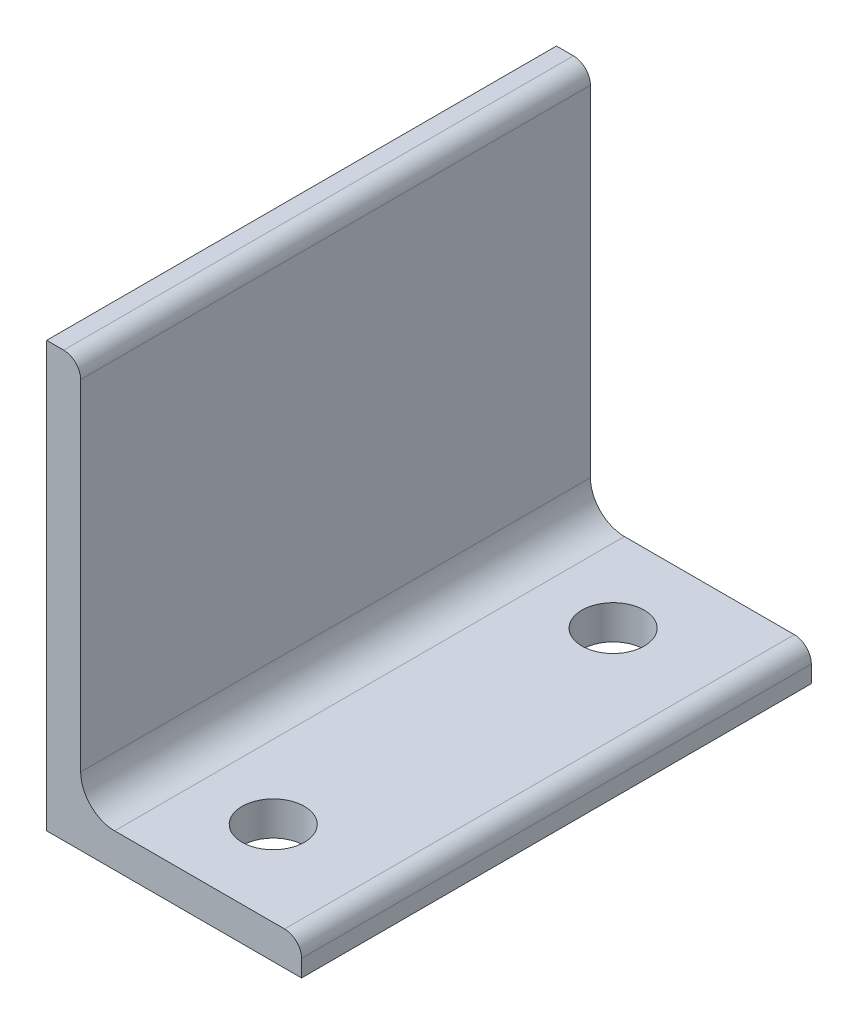
ISO-10303-21;
HEADER;
FILE_DESCRIPTION(('STEP AP214'),'2;1');
FILE_NAME('part.step','',(''),(''),'','','');
FILE_SCHEMA(('AUTOMOTIVE_DESIGN { 1 0 10303 214 1 1 1 1 }'));
ENDSEC;
DATA;
#1=APPLICATION_CONTEXT('core data for automotive mechanical design processes');
#2=APPLICATION_PROTOCOL_DEFINITION('international standard','automotive_design',2000,#1);
#3=PRODUCT_CONTEXT('',#1,'mechanical');
#4=PRODUCT('Part','Part','',(#3));
#5=PRODUCT_RELATED_PRODUCT_CATEGORY('part','',(#4));
#6=PRODUCT_DEFINITION_FORMATION('','',#4);
#7=PRODUCT_DEFINITION_CONTEXT('part definition',#1,'design');
#8=PRODUCT_DEFINITION('design','',#6,#7);
#9=PRODUCT_DEFINITION_SHAPE('','',#8);
#10=(LENGTH_UNIT() NAMED_UNIT(*) SI_UNIT(.MILLI.,.METRE.));
#11=(NAMED_UNIT(*) PLANE_ANGLE_UNIT() SI_UNIT($,.RADIAN.));
#12=(NAMED_UNIT(*) SI_UNIT($,.STERADIAN.) SOLID_ANGLE_UNIT());
#13=UNCERTAINTY_MEASURE_WITH_UNIT(LENGTH_MEASURE(1.E-05),#10,'distance_accuracy_value','');
#14=(GEOMETRIC_REPRESENTATION_CONTEXT(3) GLOBAL_UNCERTAINTY_ASSIGNED_CONTEXT((#13)) GLOBAL_UNIT_ASSIGNED_CONTEXT((#10,
#11,#12)) REPRESENTATION_CONTEXT('',''));
#15=CARTESIAN_POINT('',(0.,0.,0.));
#16=DIRECTION('',(0.,0.,1.));
#17=DIRECTION('',(1.,0.,0.));
#18=AXIS2_PLACEMENT_3D('',#15,#16,#17);
#19=CARTESIAN_POINT('',(-45.,-75.,90.));
#20=DIRECTION('',(0.,1.,0.));
#21=DIRECTION('',(0.,0.,1.));
#22=AXIS2_PLACEMENT_3D('',#19,#20,#21);
#23=PLANE('',#22);
#24=CARTESIAN_POINT('',(5.,-75.,60.));
#25=DIRECTION('',(0.,1.,0.));
#26=DIRECTION('',(0.,0.,1.));
#27=AXIS2_PLACEMENT_3D('',#24,#25,#26);
#28=CIRCLE('',#27,11.);
#29=CARTESIAN_POINT('',(-6.,-75.,60.));
#30=VERTEX_POINT('',#29);
#31=EDGE_CURVE('E146',#30,#30,#28,.F.);
#32=ORIENTED_EDGE('',*,*,#31,.F.);
#33=EDGE_LOOP('',(#32));
#34=FACE_BOUND('',#33,.T.);
#35=CARTESIAN_POINT('',(5.,-75.,-60.));
#36=DIRECTION('',(0.,1.,0.));
#37=DIRECTION('',(0.,0.,1.));
#38=AXIS2_PLACEMENT_3D('',#35,#36,#37);
#39=CIRCLE('',#38,11.);
#40=CARTESIAN_POINT('',(-5.99999999999999,-75.,-60.));
#41=VERTEX_POINT('',#40);
#42=EDGE_CURVE('E204',#41,#41,#39,.F.);
#43=ORIENTED_EDGE('',*,*,#42,.F.);
#44=EDGE_LOOP('',(#43));
#45=FACE_BOUND('',#44,.T.);
#46=DIRECTION('',(1.,0.,0.));
#47=VECTOR('',#46,1.);
#48=CARTESIAN_POINT('',(-45.,-75.,-90.));
#49=LINE('',#48,#47);
#50=CARTESIAN_POINT('',(-45.,-75.,-90.));
#51=VERTEX_POINT('',#50);
#52=CARTESIAN_POINT('',(45.,-75.,-90.));
#53=VERTEX_POINT('',#52);
#54=EDGE_CURVE('E142',#51,#53,#49,.T.);
#55=ORIENTED_EDGE('',*,*,#54,.T.);
#56=DIRECTION('',(0.,0.,-1.));
#57=VECTOR('',#56,1.);
#58=CARTESIAN_POINT('',(45.,-75.,90.));
#59=LINE('',#58,#57);
#60=CARTESIAN_POINT('',(45.,-75.,90.));
#61=VERTEX_POINT('',#60);
#62=EDGE_CURVE('E11',#61,#53,#59,.T.);
#63=ORIENTED_EDGE('',*,*,#62,.F.);
#64=DIRECTION('',(1.,0.,0.));
#65=VECTOR('',#64,1.);
#66=CARTESIAN_POINT('',(-45.,-75.,90.));
#67=LINE('',#66,#65);
#68=CARTESIAN_POINT('',(-45.,-75.,90.));
#69=VERTEX_POINT('',#68);
#70=EDGE_CURVE('E159',#69,#61,#67,.T.);
#71=ORIENTED_EDGE('',*,*,#70,.F.);
#72=DIRECTION('',(0.,0.,-1.));
#73=VECTOR('',#72,1.);
#74=CARTESIAN_POINT('',(-45.,-75.,90.));
#75=LINE('',#74,#73);
#76=EDGE_CURVE('E138',#69,#51,#75,.T.);
#77=ORIENTED_EDGE('',*,*,#76,.T.);
#78=EDGE_LOOP('',(#55,#63,#71,#77));
#79=FACE_BOUND('',#78,.T.);
#80=ADVANCED_FACE('F40',(#34,#45,#79),#23,.F.);
#81=CARTESIAN_POINT('',(45.,-75.,90.));
#82=DIRECTION('',(-1.,0.,0.));
#83=DIRECTION('',(0.,0.,1.));
#84=AXIS2_PLACEMENT_3D('',#81,#82,#83);
#85=PLANE('',#84);
#86=DIRECTION('',(0.,1.,0.));
#87=VECTOR('',#86,1.);
#88=CARTESIAN_POINT('',(45.,-75.,-90.));
#89=LINE('',#88,#87);
#90=CARTESIAN_POINT('',(45.,-69.,-90.));
#91=VERTEX_POINT('',#90);
#92=EDGE_CURVE('E145',#53,#91,#89,.T.);
#93=ORIENTED_EDGE('',*,*,#92,.T.);
#94=DIRECTION('',(0.,0.,-1.));
#95=VECTOR('',#94,1.);
#96=CARTESIAN_POINT('',(45.,-69.,90.));
#97=LINE('',#96,#95);
#98=CARTESIAN_POINT('',(45.,-69.,90.));
#99=VERTEX_POINT('',#98);
#100=EDGE_CURVE('E48',#99,#91,#97,.T.);
#101=ORIENTED_EDGE('',*,*,#100,.F.);
#102=DIRECTION('',(0.,1.,0.));
#103=VECTOR('',#102,1.);
#104=CARTESIAN_POINT('',(45.,-75.,90.));
#105=LINE('',#104,#103);
#106=EDGE_CURVE('E102',#61,#99,#105,.T.);
#107=ORIENTED_EDGE('',*,*,#106,.F.);
#108=ORIENTED_EDGE('',*,*,#62,.T.);
#109=EDGE_LOOP('',(#93,#101,#107,#108));
#110=FACE_BOUND('',#109,.T.);
#111=ADVANCED_FACE('F228',(#110),#85,.F.);
#112=CARTESIAN_POINT('',(39.,-69.,90.));
#113=DIRECTION('',(0.,0.,-1.));
#114=DIRECTION('',(-1.,0.,0.));
#115=AXIS2_PLACEMENT_3D('',#112,#113,#114);
#116=CYLINDRICAL_SURFACE('',#115,6.);
#117=CARTESIAN_POINT('',(39.,-69.,-90.));
#118=DIRECTION('',(0.,0.,1.));
#119=DIRECTION('',(1.,0.,0.));
#120=AXIS2_PLACEMENT_3D('',#117,#118,#119);
#121=CIRCLE('',#120,6.);
#122=CARTESIAN_POINT('',(39.,-63.,-90.));
#123=VERTEX_POINT('',#122);
#124=EDGE_CURVE('E148',#91,#123,#121,.T.);
#125=ORIENTED_EDGE('',*,*,#124,.T.);
#126=DIRECTION('',(0.,0.,-1.));
#127=VECTOR('',#126,1.);
#128=CARTESIAN_POINT('',(39.,-63.,90.));
#129=LINE('',#128,#127);
#130=CARTESIAN_POINT('',(39.,-63.,90.));
#131=VERTEX_POINT('',#130);
#132=EDGE_CURVE('E169',#131,#123,#129,.T.);
#133=ORIENTED_EDGE('',*,*,#132,.F.);
#134=CARTESIAN_POINT('',(39.,-69.,90.));
#135=DIRECTION('',(0.,0.,1.));
#136=DIRECTION('',(1.,0.,0.));
#137=AXIS2_PLACEMENT_3D('',#134,#135,#136);
#138=CIRCLE('',#137,6.);
#139=EDGE_CURVE('E177',#99,#131,#138,.T.);
#140=ORIENTED_EDGE('',*,*,#139,.F.);
#141=ORIENTED_EDGE('',*,*,#100,.T.);
#142=EDGE_LOOP('',(#125,#133,#140,#141));
#143=FACE_BOUND('',#142,.T.);
#144=ADVANCED_FACE('F175',(#143),#116,.T.);
#145=CARTESIAN_POINT('',(39.,-63.,90.));
#146=DIRECTION('',(0.,-1.,0.));
#147=DIRECTION('',(0.,0.,-1.));
#148=AXIS2_PLACEMENT_3D('',#145,#146,#147);
#149=PLANE('',#148);
#150=CARTESIAN_POINT('',(5.,-63.,60.));
#151=DIRECTION('',(0.,1.,0.));
#152=DIRECTION('',(-1.,0.,0.));
#153=AXIS2_PLACEMENT_3D('',#150,#151,#152);
#154=CIRCLE('',#153,11.);
#155=CARTESIAN_POINT('',(-6.,-63.,60.));
#156=VERTEX_POINT('',#155);
#157=EDGE_CURVE('E203',#156,#156,#154,.T.);
#158=ORIENTED_EDGE('',*,*,#157,.F.);
#159=EDGE_LOOP('',(#158));
#160=FACE_BOUND('',#159,.T.);
#161=CARTESIAN_POINT('',(5.,-63.,-60.));
#162=DIRECTION('',(0.,1.,0.));
#163=DIRECTION('',(-1.,0.,0.));
#164=AXIS2_PLACEMENT_3D('',#161,#162,#163);
#165=CIRCLE('',#164,11.);
#166=CARTESIAN_POINT('',(-6.,-63.,-60.));
#167=VERTEX_POINT('',#166);
#168=EDGE_CURVE('E200',#167,#167,#165,.T.);
#169=ORIENTED_EDGE('',*,*,#168,.F.);
#170=EDGE_LOOP('',(#169));
#171=FACE_BOUND('',#170,.T.);
#172=DIRECTION('',(-1.,0.,0.));
#173=VECTOR('',#172,1.);
#174=CARTESIAN_POINT('',(39.,-63.,-90.));
#175=LINE('',#174,#173);
#176=CARTESIAN_POINT('',(-21.,-63.,-90.));
#177=VERTEX_POINT('',#176);
#178=EDGE_CURVE('E150',#123,#177,#175,.T.);
#179=ORIENTED_EDGE('',*,*,#178,.T.);
#180=DIRECTION('',(0.,0.,-1.));
#181=VECTOR('',#180,1.);
#182=CARTESIAN_POINT('',(-21.,-63.,90.));
#183=LINE('',#182,#181);
#184=CARTESIAN_POINT('',(-21.,-63.,90.));
#185=VERTEX_POINT('',#184);
#186=EDGE_CURVE('E166',#185,#177,#183,.T.);
#187=ORIENTED_EDGE('',*,*,#186,.F.);
#188=DIRECTION('',(-1.,0.,0.));
#189=VECTOR('',#188,1.);
#190=CARTESIAN_POINT('',(39.,-63.,90.));
#191=LINE('',#190,#189);
#192=EDGE_CURVE('E193',#131,#185,#191,.T.);
#193=ORIENTED_EDGE('',*,*,#192,.F.);
#194=ORIENTED_EDGE('',*,*,#132,.T.);
#195=EDGE_LOOP('',(#179,#187,#193,#194));
#196=FACE_BOUND('',#195,.T.);
#197=ADVANCED_FACE('F186',(#160,#171,#196),#149,.F.);
#198=CARTESIAN_POINT('',(-21.,-51.,90.));
#199=DIRECTION('',(0.,0.,-1.));
#200=DIRECTION('',(-1.,0.,0.));
#201=AXIS2_PLACEMENT_3D('',#198,#199,#200);
#202=CYLINDRICAL_SURFACE('',#201,12.);
#203=CARTESIAN_POINT('',(-21.,-51.,-90.));
#204=DIRECTION('',(0.,0.,-1.));
#205=DIRECTION('',(-1.,0.,0.));
#206=AXIS2_PLACEMENT_3D('',#203,#204,#205);
#207=CIRCLE('',#206,12.);
#208=CARTESIAN_POINT('',(-33.,-51.,-90.));
#209=VERTEX_POINT('',#208);
#210=EDGE_CURVE('E152',#177,#209,#207,.T.);
#211=ORIENTED_EDGE('',*,*,#210,.T.);
#212=DIRECTION('',(0.,0.,-1.));
#213=VECTOR('',#212,1.);
#214=CARTESIAN_POINT('',(-33.,-51.,90.));
#215=LINE('',#214,#213);
#216=CARTESIAN_POINT('',(-33.,-51.,90.));
#217=VERTEX_POINT('',#216);
#218=EDGE_CURVE('E163',#217,#209,#215,.T.);
#219=ORIENTED_EDGE('',*,*,#218,.F.);
#220=CARTESIAN_POINT('',(-21.,-51.,90.));
#221=DIRECTION('',(0.,0.,-1.));
#222=DIRECTION('',(-1.,0.,0.));
#223=AXIS2_PLACEMENT_3D('',#220,#221,#222);
#224=CIRCLE('',#223,12.);
#225=EDGE_CURVE('E192',#185,#217,#224,.T.);
#226=ORIENTED_EDGE('',*,*,#225,.F.);
#227=ORIENTED_EDGE('',*,*,#186,.T.);
#228=EDGE_LOOP('',(#211,#219,#226,#227));
#229=FACE_BOUND('',#228,.T.);
#230=ADVANCED_FACE('F190',(#229),#202,.F.);
#231=CARTESIAN_POINT('',(-33.,-51.,90.));
#232=DIRECTION('',(-1.,0.,0.));
#233=DIRECTION('',(0.,0.,1.));
#234=AXIS2_PLACEMENT_3D('',#231,#232,#233);
#235=PLANE('',#234);
#236=DIRECTION('',(0.,1.,0.));
#237=VECTOR('',#236,1.);
#238=CARTESIAN_POINT('',(-33.,-51.,-90.));
#239=LINE('',#238,#237);
#240=CARTESIAN_POINT('',(-33.,69.,-90.));
#241=VERTEX_POINT('',#240);
#242=EDGE_CURVE('E154',#209,#241,#239,.T.);
#243=ORIENTED_EDGE('',*,*,#242,.T.);
#244=DIRECTION('',(0.,0.,-1.));
#245=VECTOR('',#244,1.);
#246=CARTESIAN_POINT('',(-33.,69.,90.));
#247=LINE('',#246,#245);
#248=CARTESIAN_POINT('',(-33.,69.,90.));
#249=VERTEX_POINT('',#248);
#250=EDGE_CURVE('E133',#249,#241,#247,.T.);
#251=ORIENTED_EDGE('',*,*,#250,.F.);
#252=DIRECTION('',(0.,1.,0.));
#253=VECTOR('',#252,1.);
#254=CARTESIAN_POINT('',(-33.,-51.,90.));
#255=LINE('',#254,#253);
#256=EDGE_CURVE('E124',#217,#249,#255,.T.);
#257=ORIENTED_EDGE('',*,*,#256,.F.);
#258=ORIENTED_EDGE('',*,*,#218,.T.);
#259=EDGE_LOOP('',(#243,#251,#257,#258));
#260=FACE_BOUND('',#259,.T.);
#261=ADVANCED_FACE('F233',(#260),#235,.F.);
#262=CARTESIAN_POINT('',(-39.,69.,90.));
#263=DIRECTION('',(0.,0.,-1.));
#264=DIRECTION('',(-1.,0.,0.));
#265=AXIS2_PLACEMENT_3D('',#262,#263,#264);
#266=CYLINDRICAL_SURFACE('',#265,6.00000000000001);
#267=CARTESIAN_POINT('',(-39.,69.,-90.));
#268=DIRECTION('',(0.,0.,1.));
#269=DIRECTION('',(1.,0.,0.));
#270=AXIS2_PLACEMENT_3D('',#267,#268,#269);
#271=CIRCLE('',#270,6.00000000000001);
#272=CARTESIAN_POINT('',(-39.,75.,-90.));
#273=VERTEX_POINT('',#272);
#274=EDGE_CURVE('E132',#241,#273,#271,.T.);
#275=ORIENTED_EDGE('',*,*,#274,.T.);
#276=DIRECTION('',(0.,0.,-1.));
#277=VECTOR('',#276,1.);
#278=CARTESIAN_POINT('',(-39.,75.,90.));
#279=LINE('',#278,#277);
#280=CARTESIAN_POINT('',(-39.,75.,90.));
#281=VERTEX_POINT('',#280);
#282=EDGE_CURVE('E129',#281,#273,#279,.T.);
#283=ORIENTED_EDGE('',*,*,#282,.F.);
#284=CARTESIAN_POINT('',(-39.,69.,90.));
#285=DIRECTION('',(0.,0.,1.));
#286=DIRECTION('',(1.,0.,0.));
#287=AXIS2_PLACEMENT_3D('',#284,#285,#286);
#288=CIRCLE('',#287,6.00000000000001);
#289=EDGE_CURVE('E118',#249,#281,#288,.T.);
#290=ORIENTED_EDGE('',*,*,#289,.F.);
#291=ORIENTED_EDGE('',*,*,#250,.T.);
#292=EDGE_LOOP('',(#275,#283,#290,#291));
#293=FACE_BOUND('',#292,.T.);
#294=ADVANCED_FACE('F130',(#293),#266,.T.);
#295=CARTESIAN_POINT('',(-39.,75.,90.));
#296=DIRECTION('',(0.,-1.,0.));
#297=DIRECTION('',(1.,0.,0.));
#298=AXIS2_PLACEMENT_3D('',#295,#296,#297);
#299=PLANE('',#298);
#300=DIRECTION('',(-1.,0.,0.));
#301=VECTOR('',#300,1.);
#302=CARTESIAN_POINT('',(-39.,75.,-90.));
#303=LINE('',#302,#301);
#304=CARTESIAN_POINT('',(-45.,75.,-90.));
#305=VERTEX_POINT('',#304);
#306=EDGE_CURVE('E88',#273,#305,#303,.T.);
#307=ORIENTED_EDGE('',*,*,#306,.T.);
#308=DIRECTION('',(0.,0.,-1.));
#309=VECTOR('',#308,1.);
#310=CARTESIAN_POINT('',(-45.,75.,90.));
#311=LINE('',#310,#309);
#312=CARTESIAN_POINT('',(-45.,75.,90.));
#313=VERTEX_POINT('',#312);
#314=EDGE_CURVE('E134',#313,#305,#311,.T.);
#315=ORIENTED_EDGE('',*,*,#314,.F.);
#316=DIRECTION('',(-1.,0.,0.));
#317=VECTOR('',#316,1.);
#318=CARTESIAN_POINT('',(-39.,75.,90.));
#319=LINE('',#318,#317);
#320=EDGE_CURVE('E122',#281,#313,#319,.T.);
#321=ORIENTED_EDGE('',*,*,#320,.F.);
#322=ORIENTED_EDGE('',*,*,#282,.T.);
#323=EDGE_LOOP('',(#307,#315,#321,#322));
#324=FACE_BOUND('',#323,.T.);
#325=ADVANCED_FACE('F136',(#324),#299,.F.);
#326=CARTESIAN_POINT('',(-45.,75.,90.));
#327=DIRECTION('',(1.,0.,0.));
#328=DIRECTION('',(0.,1.,0.));
#329=AXIS2_PLACEMENT_3D('',#326,#327,#328);
#330=PLANE('',#329);
#331=DIRECTION('',(0.,-1.,0.));
#332=VECTOR('',#331,1.);
#333=CARTESIAN_POINT('',(-45.,75.,-90.));
#334=LINE('',#333,#332);
#335=EDGE_CURVE('E94',#305,#51,#334,.T.);
#336=ORIENTED_EDGE('',*,*,#335,.T.);
#337=ORIENTED_EDGE('',*,*,#76,.F.);
#338=DIRECTION('',(0.,-1.,0.));
#339=VECTOR('',#338,1.);
#340=CARTESIAN_POINT('',(-45.,75.,90.));
#341=LINE('',#340,#339);
#342=EDGE_CURVE('E56',#313,#69,#341,.T.);
#343=ORIENTED_EDGE('',*,*,#342,.F.);
#344=ORIENTED_EDGE('',*,*,#314,.T.);
#345=EDGE_LOOP('',(#336,#337,#343,#344));
#346=FACE_BOUND('',#345,.T.);
#347=ADVANCED_FACE('F283',(#346),#330,.F.);
#348=CARTESIAN_POINT('',(39.,-69.,90.));
#349=DIRECTION('',(0.,0.,1.));
#350=DIRECTION('',(1.,0.,0.));
#351=AXIS2_PLACEMENT_3D('',#348,#349,#350);
#352=PLANE('',#351);
#353=ORIENTED_EDGE('',*,*,#70,.T.);
#354=ORIENTED_EDGE('',*,*,#106,.T.);
#355=ORIENTED_EDGE('',*,*,#139,.T.);
#356=ORIENTED_EDGE('',*,*,#192,.T.);
#357=ORIENTED_EDGE('',*,*,#225,.T.);
#358=ORIENTED_EDGE('',*,*,#256,.T.);
#359=ORIENTED_EDGE('',*,*,#289,.T.);
#360=ORIENTED_EDGE('',*,*,#320,.T.);
#361=ORIENTED_EDGE('',*,*,#342,.T.);
#362=EDGE_LOOP('',(#353,#354,#355,#356,#357,#358,#359,#360,#361));
#363=FACE_BOUND('',#362,.T.);
#364=ADVANCED_FACE('F120',(#363),#352,.T.);
#365=CARTESIAN_POINT('',(39.,-69.,-90.));
#366=DIRECTION('',(0.,0.,1.));
#367=DIRECTION('',(1.,0.,0.));
#368=AXIS2_PLACEMENT_3D('',#365,#366,#367);
#369=PLANE('',#368);
#370=ORIENTED_EDGE('',*,*,#54,.F.);
#371=ORIENTED_EDGE('',*,*,#335,.F.);
#372=ORIENTED_EDGE('',*,*,#306,.F.);
#373=ORIENTED_EDGE('',*,*,#274,.F.);
#374=ORIENTED_EDGE('',*,*,#242,.F.);
#375=ORIENTED_EDGE('',*,*,#210,.F.);
#376=ORIENTED_EDGE('',*,*,#178,.F.);
#377=ORIENTED_EDGE('',*,*,#124,.F.);
#378=ORIENTED_EDGE('',*,*,#92,.F.);
#379=EDGE_LOOP('',(#370,#371,#372,#373,#374,#375,#376,#377,#378));
#380=FACE_BOUND('',#379,.T.);
#381=ADVANCED_FACE('F181',(#380),#369,.F.);
#382=CARTESIAN_POINT('',(5.,-75.001,-60.));
#383=DIRECTION('',(0.,1.,0.));
#384=DIRECTION('',(-1.,0.,0.));
#385=AXIS2_PLACEMENT_3D('',#382,#383,#384);
#386=CYLINDRICAL_SURFACE('',#385,11.);
#387=CARTESIAN_POINT('',(-6.,-63.,-60.));
#388=CARTESIAN_POINT('',(-6.,-63.125,-60.));
#389=CARTESIAN_POINT('',(-6.,-63.25,-60.));
#390=CARTESIAN_POINT('',(-6.,-63.5,-60.));
#391=CARTESIAN_POINT('',(-6.,-63.625,-60.));
#392=CARTESIAN_POINT('',(-6.,-63.875,-60.));
#393=CARTESIAN_POINT('',(-6.,-64.,-60.));
#394=CARTESIAN_POINT('',(-6.,-64.25,-60.));
#395=CARTESIAN_POINT('',(-6.,-64.375,-60.));
#396=CARTESIAN_POINT('',(-6.,-64.625,-60.));
#397=CARTESIAN_POINT('',(-6.,-64.75,-60.));
#398=CARTESIAN_POINT('',(-6.,-65.,-60.));
#399=CARTESIAN_POINT('',(-6.,-65.125,-60.));
#400=CARTESIAN_POINT('',(-6.,-65.375,-60.));
#401=CARTESIAN_POINT('',(-6.,-65.5,-60.));
#402=CARTESIAN_POINT('',(-6.,-65.75,-60.));
#403=CARTESIAN_POINT('',(-6.,-65.875,-60.));
#404=CARTESIAN_POINT('',(-6.,-66.125,-60.));
#405=CARTESIAN_POINT('',(-6.,-66.25,-60.));
#406=CARTESIAN_POINT('',(-6.,-66.5,-60.));
#407=CARTESIAN_POINT('',(-6.,-66.625,-60.));
#408=CARTESIAN_POINT('',(-6.,-66.875,-60.));
#409=CARTESIAN_POINT('',(-6.,-67.,-60.));
#410=CARTESIAN_POINT('',(-6.,-67.25,-60.));
#411=CARTESIAN_POINT('',(-6.,-67.375,-60.));
#412=CARTESIAN_POINT('',(-6.,-67.625,-60.));
#413=CARTESIAN_POINT('',(-6.,-67.75,-60.));
#414=CARTESIAN_POINT('',(-6.,-68.,-60.));
#415=CARTESIAN_POINT('',(-6.,-68.125,-60.));
#416=CARTESIAN_POINT('',(-6.,-68.375,-60.));
#417=CARTESIAN_POINT('',(-6.,-68.5,-60.));
#418=CARTESIAN_POINT('',(-6.,-68.75,-60.));
#419=CARTESIAN_POINT('',(-6.,-68.875,-60.));
#420=CARTESIAN_POINT('',(-6.,-69.125,-60.));
#421=CARTESIAN_POINT('',(-6.,-69.25,-60.));
#422=CARTESIAN_POINT('',(-6.,-69.5,-60.));
#423=CARTESIAN_POINT('',(-6.,-69.625,-60.));
#424=CARTESIAN_POINT('',(-6.,-69.875,-60.));
#425=CARTESIAN_POINT('',(-6.,-70.,-60.));
#426=CARTESIAN_POINT('',(-6.,-70.25,-60.));
#427=CARTESIAN_POINT('',(-6.,-70.375,-60.));
#428=CARTESIAN_POINT('',(-6.,-70.625,-60.));
#429=CARTESIAN_POINT('',(-6.,-70.75,-60.));
#430=CARTESIAN_POINT('',(-6.,-71.,-60.));
#431=CARTESIAN_POINT('',(-6.,-71.125,-60.));
#432=CARTESIAN_POINT('',(-6.,-71.375,-60.));
#433=CARTESIAN_POINT('',(-5.99999999999999,-71.5,-60.));
#434=CARTESIAN_POINT('',(-5.99999999999999,-71.75,-60.));
#435=CARTESIAN_POINT('',(-5.99999999999999,-71.875,-60.));
#436=CARTESIAN_POINT('',(-5.99999999999999,-72.125,-60.));
#437=CARTESIAN_POINT('',(-5.99999999999999,-72.25,-60.));
#438=CARTESIAN_POINT('',(-5.99999999999999,-72.5,-60.));
#439=CARTESIAN_POINT('',(-5.99999999999999,-72.625,-60.));
#440=CARTESIAN_POINT('',(-5.99999999999999,-72.875,-60.));
#441=CARTESIAN_POINT('',(-5.99999999999999,-73.,-60.));
#442=CARTESIAN_POINT('',(-5.99999999999999,-73.25,-60.));
#443=CARTESIAN_POINT('',(-5.99999999999999,-73.375,-60.));
#444=CARTESIAN_POINT('',(-5.99999999999999,-73.625,-60.));
#445=CARTESIAN_POINT('',(-5.99999999999999,-73.75,-60.));
#446=CARTESIAN_POINT('',(-5.99999999999999,-74.,-60.));
#447=CARTESIAN_POINT('',(-5.99999999999999,-74.125,-60.));
#448=CARTESIAN_POINT('',(-5.99999999999999,-74.375,-60.));
#449=CARTESIAN_POINT('',(-5.99999999999999,-74.5,-60.));
#450=CARTESIAN_POINT('',(-5.99999999999999,-74.75,-60.));
#451=CARTESIAN_POINT('',(-5.99999999999999,-74.875,-60.));
#452=CARTESIAN_POINT('',(-5.99999999999999,-75.,-60.));
#453=B_SPLINE_CURVE_WITH_KNOTS('',3,(#387,#388,#389,#390,#391,#392,#393,#394,#395,#396,#397,
#398,#399,#400,#401,#402,#403,#404,#405,#406,#407,#408,#409,#410,#411,#412,#413,#414,#415,#416,
#417,#418,#419,#420,#421,#422,#423,#424,#425,#426,#427,#428,#429,#430,#431,#432,#433,#434,#435,
#436,#437,#438,#439,#440,#441,#442,#443,#444,#445,#446,#447,#448,#449,#450,#451,#452),
.UNSPECIFIED.,.F.,.F.,(4,2,2,2,2,2,2,2,2,2,2,2,2,2,2,2,2,2,2,2,2,2,2,2,2,2,2,2,2,2,2,2,4),(0.,
0.375,0.750000000000001,1.125,1.49999999999999,1.875,2.24999999999999,2.62499999999999,
2.99999999999999,3.37499999999999,3.74999999999999,4.12499999999999,4.49999999999999,
4.87499999999999,5.24999999999999,5.62499999999999,5.99999999999999,6.37499999999999,
6.74999999999999,7.12499999999999,7.49999999999999,7.87499999999999,8.24999999999999,
8.62499999999999,8.99999999999999,9.37499999999999,9.74999999999999,10.125,10.5,10.875,11.25,
11.625,12.),.UNSPECIFIED.);
#454=EDGE_CURVE('BSEAM220',#167,#41,#453,.T.);
#455=ORIENTED_EDGE('',*,*,#168,.T.);
#456=ORIENTED_EDGE('',*,*,#42,.T.);
#457=ORIENTED_EDGE('',*,*,#454,.T.);
#458=ORIENTED_EDGE('',*,*,#454,.F.);
#459=EDGE_LOOP('',(#455,#457,#456,#458));
#460=FACE_BOUND('',#459,.T.);
#461=ADVANCED_FACE('F220',(#460),#386,.F.);
#462=CARTESIAN_POINT('',(5.,-75.001,60.));
#463=DIRECTION('',(0.,1.,0.));
#464=DIRECTION('',(-1.,0.,0.));
#465=AXIS2_PLACEMENT_3D('',#462,#463,#464);
#466=CYLINDRICAL_SURFACE('',#465,11.);
#467=CARTESIAN_POINT('',(-6.,-63.,60.));
#468=CARTESIAN_POINT('',(-6.,-63.125,60.));
#469=CARTESIAN_POINT('',(-6.,-63.25,60.));
#470=CARTESIAN_POINT('',(-6.,-63.5,60.));
#471=CARTESIAN_POINT('',(-6.,-63.625,60.));
#472=CARTESIAN_POINT('',(-6.,-63.875,60.));
#473=CARTESIAN_POINT('',(-6.,-64.,60.));
#474=CARTESIAN_POINT('',(-6.,-64.25,60.));
#475=CARTESIAN_POINT('',(-6.,-64.375,60.));
#476=CARTESIAN_POINT('',(-6.,-64.625,60.));
#477=CARTESIAN_POINT('',(-6.,-64.75,60.));
#478=CARTESIAN_POINT('',(-6.,-65.,60.));
#479=CARTESIAN_POINT('',(-6.,-65.125,60.));
#480=CARTESIAN_POINT('',(-6.,-65.375,60.));
#481=CARTESIAN_POINT('',(-6.,-65.5,60.));
#482=CARTESIAN_POINT('',(-6.,-65.75,60.));
#483=CARTESIAN_POINT('',(-6.,-65.875,60.));
#484=CARTESIAN_POINT('',(-6.,-66.125,60.));
#485=CARTESIAN_POINT('',(-6.,-66.25,60.));
#486=CARTESIAN_POINT('',(-6.,-66.5,60.));
#487=CARTESIAN_POINT('',(-6.,-66.625,60.));
#488=CARTESIAN_POINT('',(-6.,-66.875,60.));
#489=CARTESIAN_POINT('',(-6.,-67.,60.));
#490=CARTESIAN_POINT('',(-6.,-67.25,60.));
#491=CARTESIAN_POINT('',(-6.,-67.375,60.));
#492=CARTESIAN_POINT('',(-6.,-67.625,60.));
#493=CARTESIAN_POINT('',(-6.,-67.75,60.));
#494=CARTESIAN_POINT('',(-6.,-68.,60.));
#495=CARTESIAN_POINT('',(-6.,-68.125,60.));
#496=CARTESIAN_POINT('',(-6.,-68.375,60.));
#497=CARTESIAN_POINT('',(-6.,-68.5,60.));
#498=CARTESIAN_POINT('',(-6.,-68.75,60.));
#499=CARTESIAN_POINT('',(-6.,-68.875,60.));
#500=CARTESIAN_POINT('',(-6.,-69.125,60.));
#501=CARTESIAN_POINT('',(-6.,-69.25,60.));
#502=CARTESIAN_POINT('',(-6.,-69.5,60.));
#503=CARTESIAN_POINT('',(-6.,-69.625,60.));
#504=CARTESIAN_POINT('',(-6.,-69.875,60.));
#505=CARTESIAN_POINT('',(-6.,-70.,60.));
#506=CARTESIAN_POINT('',(-6.,-70.25,60.));
#507=CARTESIAN_POINT('',(-6.,-70.375,60.));
#508=CARTESIAN_POINT('',(-6.,-70.625,60.));
#509=CARTESIAN_POINT('',(-6.,-70.75,60.));
#510=CARTESIAN_POINT('',(-6.,-71.,60.));
#511=CARTESIAN_POINT('',(-6.,-71.125,60.));
#512=CARTESIAN_POINT('',(-6.,-71.375,60.));
#513=CARTESIAN_POINT('',(-6.,-71.5,60.));
#514=CARTESIAN_POINT('',(-6.,-71.75,60.));
#515=CARTESIAN_POINT('',(-6.,-71.875,60.));
#516=CARTESIAN_POINT('',(-6.,-72.125,60.));
#517=CARTESIAN_POINT('',(-6.,-72.25,60.));
#518=CARTESIAN_POINT('',(-6.,-72.5,60.));
#519=CARTESIAN_POINT('',(-6.,-72.625,60.));
#520=CARTESIAN_POINT('',(-6.,-72.875,60.));
#521=CARTESIAN_POINT('',(-6.,-73.,60.));
#522=CARTESIAN_POINT('',(-6.,-73.25,60.));
#523=CARTESIAN_POINT('',(-6.,-73.375,60.));
#524=CARTESIAN_POINT('',(-6.,-73.625,60.));
#525=CARTESIAN_POINT('',(-6.,-73.75,60.));
#526=CARTESIAN_POINT('',(-6.,-74.,60.));
#527=CARTESIAN_POINT('',(-6.,-74.125,60.));
#528=CARTESIAN_POINT('',(-6.,-74.375,60.));
#529=CARTESIAN_POINT('',(-6.,-74.5,60.));
#530=CARTESIAN_POINT('',(-6.,-74.75,60.));
#531=CARTESIAN_POINT('',(-6.,-74.875,60.));
#532=CARTESIAN_POINT('',(-6.,-75.,60.));
#533=B_SPLINE_CURVE_WITH_KNOTS('',3,(#467,#468,#469,#470,#471,#472,#473,#474,#475,#476,#477,
#478,#479,#480,#481,#482,#483,#484,#485,#486,#487,#488,#489,#490,#491,#492,#493,#494,#495,#496,
#497,#498,#499,#500,#501,#502,#503,#504,#505,#506,#507,#508,#509,#510,#511,#512,#513,#514,#515,
#516,#517,#518,#519,#520,#521,#522,#523,#524,#525,#526,#527,#528,#529,#530,#531,#532),
.UNSPECIFIED.,.F.,.F.,(4,2,2,2,2,2,2,2,2,2,2,2,2,2,2,2,2,2,2,2,2,2,2,2,2,2,2,2,2,2,2,2,4),(0.,
0.375,0.750000000000001,1.125,1.49999999999999,1.875,2.24999999999999,2.62499999999999,
2.99999999999999,3.37499999999999,3.74999999999999,4.12499999999999,4.49999999999999,
4.87499999999999,5.24999999999999,5.62499999999999,5.99999999999999,6.37499999999999,
6.74999999999999,7.12499999999999,7.49999999999999,7.87499999999999,8.24999999999999,
8.62499999999999,8.99999999999999,9.37499999999999,9.74999999999999,10.125,10.5,10.875,11.25,
11.625,12.),.UNSPECIFIED.);
#534=EDGE_CURVE('BSEAM212',#156,#30,#533,.T.);
#535=ORIENTED_EDGE('',*,*,#157,.T.);
#536=ORIENTED_EDGE('',*,*,#31,.T.);
#537=ORIENTED_EDGE('',*,*,#534,.T.);
#538=ORIENTED_EDGE('',*,*,#534,.F.);
#539=EDGE_LOOP('',(#535,#537,#536,#538));
#540=FACE_BOUND('',#539,.T.);
#541=ADVANCED_FACE('F212',(#540),#466,.F.);
#542=CLOSED_SHELL('',(#80,#111,#144,#197,#230,#261,#294,#325,#347,#364,#381,#461,#541));
#543=MANIFOLD_SOLID_BREP('B2',#542);
#544=ADVANCED_BREP_SHAPE_REPRESENTATION('',(#18,#543),#14);
#545=SHAPE_DEFINITION_REPRESENTATION(#9,#544);
ENDSEC;
END-ISO-10303-21;
